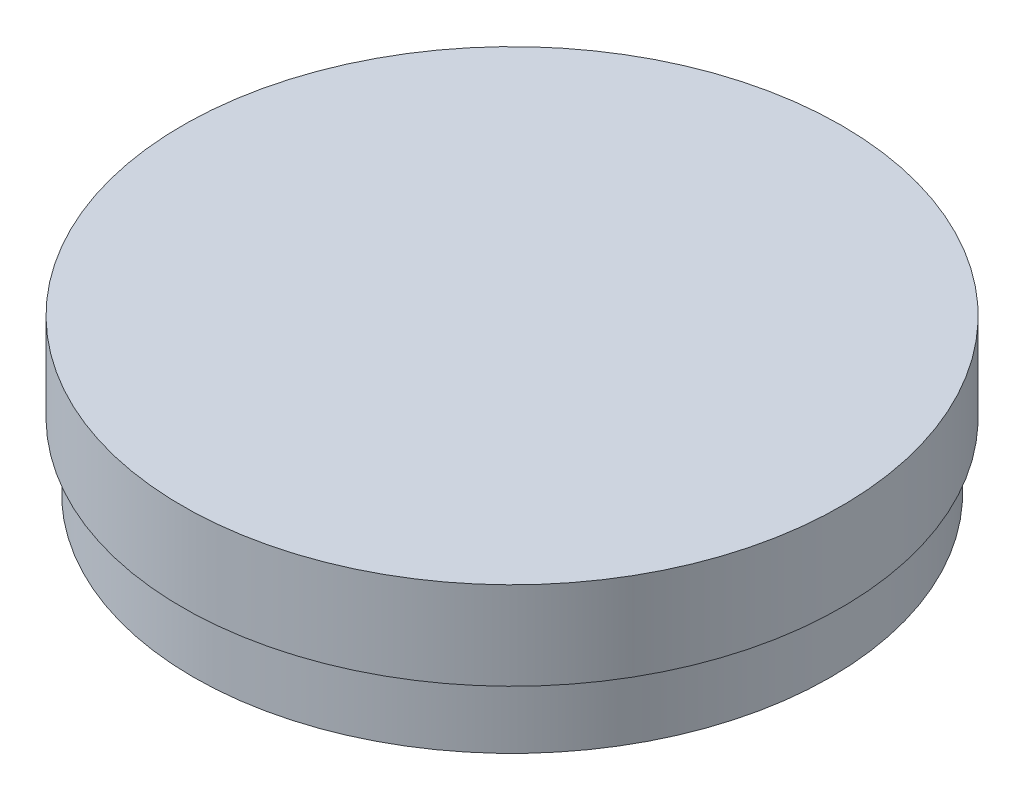
ISO-10303-21;
HEADER;
FILE_DESCRIPTION(('STEP AP214'),'2;1');
FILE_NAME('part.step','',(''),(''),'','','');
FILE_SCHEMA(('AUTOMOTIVE_DESIGN { 1 0 10303 214 1 1 1 1 }'));
ENDSEC;
DATA;
#1=APPLICATION_CONTEXT('core data for automotive mechanical design processes');
#2=APPLICATION_PROTOCOL_DEFINITION('international standard','automotive_design',2000,#1);
#3=PRODUCT_CONTEXT('',#1,'mechanical');
#4=PRODUCT('Part','Part','',(#3));
#5=PRODUCT_RELATED_PRODUCT_CATEGORY('part','',(#4));
#6=PRODUCT_DEFINITION_FORMATION('','',#4);
#7=PRODUCT_DEFINITION_CONTEXT('part definition',#1,'design');
#8=PRODUCT_DEFINITION('design','',#6,#7);
#9=PRODUCT_DEFINITION_SHAPE('','',#8);
#10=(LENGTH_UNIT() NAMED_UNIT(*) SI_UNIT(.MILLI.,.METRE.));
#11=(NAMED_UNIT(*) PLANE_ANGLE_UNIT() SI_UNIT($,.RADIAN.));
#12=(NAMED_UNIT(*) SI_UNIT($,.STERADIAN.) SOLID_ANGLE_UNIT());
#13=UNCERTAINTY_MEASURE_WITH_UNIT(LENGTH_MEASURE(1.E-05),#10,'distance_accuracy_value','');
#14=(GEOMETRIC_REPRESENTATION_CONTEXT(3) GLOBAL_UNCERTAINTY_ASSIGNED_CONTEXT((#13)) GLOBAL_UNIT_ASSIGNED_CONTEXT((#10,
#11,#12)) REPRESENTATION_CONTEXT('',''));
#15=CARTESIAN_POINT('',(0.,0.,0.));
#16=DIRECTION('',(0.,0.,1.));
#17=DIRECTION('',(1.,0.,0.));
#18=AXIS2_PLACEMENT_3D('',#15,#16,#17);
#19=CARTESIAN_POINT('',(0.,0.,0.));
#20=DIRECTION('',(0.,-1.,0.));
#21=DIRECTION('',(0.,0.,-1.));
#22=AXIS2_PLACEMENT_3D('',#19,#20,#21);
#23=PLANE('',#22);
#24=CARTESIAN_POINT('',(0.,0.,0.));
#25=DIRECTION('',(0.,-1.,0.));
#26=DIRECTION('',(0.,0.,-1.));
#27=AXIS2_PLACEMENT_3D('',#24,#25,#26);
#28=CIRCLE('',#27,79.375);
#29=CARTESIAN_POINT('',(0.,0.,-79.375));
#30=VERTEX_POINT('',#29);
#31=EDGE_CURVE('E49',#30,#30,#28,.T.);
#32=ORIENTED_EDGE('',*,*,#31,.F.);
#33=EDGE_LOOP('',(#32));
#34=FACE_BOUND('',#33,.T.);
#35=CARTESIAN_POINT('',(0.,0.,0.));
#36=DIRECTION('',(0.,-1.,0.));
#37=DIRECTION('',(0.,0.,-1.));
#38=AXIS2_PLACEMENT_3D('',#35,#36,#37);
#39=CIRCLE('',#38,92.075);
#40=CARTESIAN_POINT('',(0.,0.,-92.075));
#41=VERTEX_POINT('',#40);
#42=EDGE_CURVE('E10',#41,#41,#39,.T.);
#43=ORIENTED_EDGE('',*,*,#42,.T.);
#44=EDGE_LOOP('',(#43));
#45=FACE_BOUND('',#44,.T.);
#46=ADVANCED_FACE('F30',(#34,#45),#23,.T.);
#47=CARTESIAN_POINT('',(0.,0.,0.));
#48=DIRECTION('',(0.,-1.,0.));
#49=DIRECTION('',(0.,0.,-1.));
#50=AXIS2_PLACEMENT_3D('',#47,#48,#49);
#51=CYLINDRICAL_SURFACE('',#50,92.075);
#52=CARTESIAN_POINT('',(0.,19.05,0.));
#53=DIRECTION('',(0.,-1.,0.));
#54=DIRECTION('',(0.,0.,-1.));
#55=AXIS2_PLACEMENT_3D('',#52,#53,#54);
#56=CIRCLE('',#55,92.075);
#57=CARTESIAN_POINT('',(0.,19.05,-92.075));
#58=VERTEX_POINT('',#57);
#59=EDGE_CURVE('E36',#58,#58,#56,.T.);
#60=ORIENTED_EDGE('',*,*,#59,.T.);
#61=EDGE_LOOP('',(#60));
#62=FACE_BOUND('',#61,.T.);
#63=ORIENTED_EDGE('',*,*,#42,.F.);
#64=EDGE_LOOP('',(#63));
#65=FACE_BOUND('',#64,.T.);
#66=ADVANCED_FACE('F66',(#62,#65),#51,.T.);
#67=CARTESIAN_POINT('',(92.075,19.05,0.));
#68=DIRECTION('',(0.,-1.,0.));
#69=DIRECTION('',(0.,0.,-1.));
#70=AXIS2_PLACEMENT_3D('',#67,#68,#69);
#71=PLANE('',#70);
#72=CARTESIAN_POINT('',(0.,19.05,0.));
#73=DIRECTION('',(0.,-1.,0.));
#74=DIRECTION('',(0.,0.,-1.));
#75=AXIS2_PLACEMENT_3D('',#72,#73,#74);
#76=CIRCLE('',#75,95.25);
#77=CARTESIAN_POINT('',(0.,19.05,-95.25));
#78=VERTEX_POINT('',#77);
#79=EDGE_CURVE('E40',#78,#78,#76,.T.);
#80=ORIENTED_EDGE('',*,*,#79,.T.);
#81=EDGE_LOOP('',(#80));
#82=FACE_BOUND('',#81,.T.);
#83=ORIENTED_EDGE('',*,*,#59,.F.);
#84=EDGE_LOOP('',(#83));
#85=FACE_BOUND('',#84,.T.);
#86=ADVANCED_FACE('F70',(#82,#85),#71,.T.);
#87=CARTESIAN_POINT('',(0.,0.,0.));
#88=DIRECTION('',(0.,-1.,0.));
#89=DIRECTION('',(0.,0.,-1.));
#90=AXIS2_PLACEMENT_3D('',#87,#88,#89);
#91=CYLINDRICAL_SURFACE('',#90,95.25);
#92=CARTESIAN_POINT('',(0.,44.45,0.));
#93=DIRECTION('',(0.,-1.,0.));
#94=DIRECTION('',(0.,0.,-1.));
#95=AXIS2_PLACEMENT_3D('',#92,#93,#94);
#96=CIRCLE('',#95,95.25);
#97=CARTESIAN_POINT('',(0.,44.45,-95.25));
#98=VERTEX_POINT('',#97);
#99=EDGE_CURVE('E44',#98,#98,#96,.T.);
#100=ORIENTED_EDGE('',*,*,#99,.T.);
#101=EDGE_LOOP('',(#100));
#102=FACE_BOUND('',#101,.T.);
#103=ORIENTED_EDGE('',*,*,#79,.F.);
#104=EDGE_LOOP('',(#103));
#105=FACE_BOUND('',#104,.T.);
#106=ADVANCED_FACE('F74',(#102,#105),#91,.T.);
#107=CARTESIAN_POINT('',(95.25,44.45,0.));
#108=DIRECTION('',(0.,1.,0.));
#109=DIRECTION('',(0.,0.,1.));
#110=AXIS2_PLACEMENT_3D('',#107,#108,#109);
#111=PLANE('',#110);
#112=ORIENTED_EDGE('',*,*,#99,.F.);
#113=EDGE_LOOP('',(#112));
#114=FACE_BOUND('',#113,.T.);
#115=ADVANCED_FACE('F61',(#114),#111,.T.);
#116=CARTESIAN_POINT('',(0.,0.,0.));
#117=DIRECTION('',(0.,-1.,0.));
#118=DIRECTION('',(0.,0.,-1.));
#119=AXIS2_PLACEMENT_3D('',#116,#117,#118);
#120=CYLINDRICAL_SURFACE('',#119,79.375);
#121=CARTESIAN_POINT('',(0.,31.75,0.));
#122=DIRECTION('',(0.,-1.,0.));
#123=DIRECTION('',(0.,0.,-1.));
#124=AXIS2_PLACEMENT_3D('',#121,#122,#123);
#125=CIRCLE('',#124,79.375);
#126=CARTESIAN_POINT('',(0.,31.75,-79.375));
#127=VERTEX_POINT('',#126);
#128=EDGE_CURVE('E52',#127,#127,#125,.T.);
#129=ORIENTED_EDGE('',*,*,#128,.F.);
#130=EDGE_LOOP('',(#129));
#131=FACE_BOUND('',#130,.T.);
#132=ORIENTED_EDGE('',*,*,#31,.T.);
#133=EDGE_LOOP('',(#132));
#134=FACE_BOUND('',#133,.T.);
#135=ADVANCED_FACE('F58',(#131,#134),#120,.F.);
#136=CARTESIAN_POINT('',(95.25,31.75,0.));
#137=DIRECTION('',(0.,1.,0.));
#138=DIRECTION('',(0.,0.,1.));
#139=AXIS2_PLACEMENT_3D('',#136,#137,#138);
#140=PLANE('',#139);
#141=ORIENTED_EDGE('',*,*,#128,.T.);
#142=EDGE_LOOP('',(#141));
#143=FACE_BOUND('',#142,.T.);
#144=ADVANCED_FACE('F56',(#143),#140,.F.);
#145=CLOSED_SHELL('',(#46,#66,#86,#106,#115,#135,#144));
#146=MANIFOLD_SOLID_BREP('B2',#145);
#147=ADVANCED_BREP_SHAPE_REPRESENTATION('',(#18,#146),#14);
#148=SHAPE_DEFINITION_REPRESENTATION(#9,#147);
ENDSEC;
END-ISO-10303-21;
